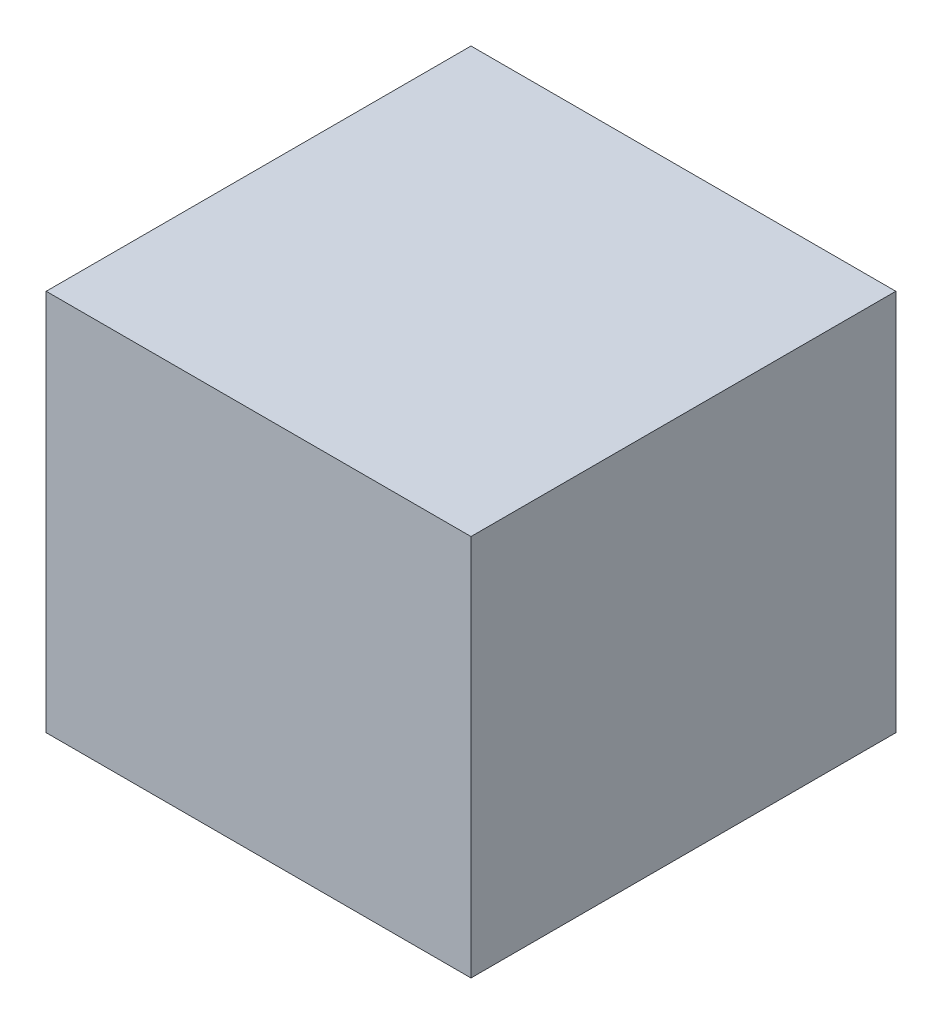
ISO-10303-21;
HEADER;
FILE_DESCRIPTION(('STEP AP214'),'2;1');
FILE_NAME('part.step','',(''),(''),'','','');
FILE_SCHEMA(('AUTOMOTIVE_DESIGN { 1 0 10303 214 1 1 1 1 }'));
ENDSEC;
DATA;
#1=APPLICATION_CONTEXT('core data for automotive mechanical design processes');
#2=APPLICATION_PROTOCOL_DEFINITION('international standard','automotive_design',2000,#1);
#3=PRODUCT_CONTEXT('',#1,'mechanical');
#4=PRODUCT('Part','Part','',(#3));
#5=PRODUCT_RELATED_PRODUCT_CATEGORY('part','',(#4));
#6=PRODUCT_DEFINITION_FORMATION('','',#4);
#7=PRODUCT_DEFINITION_CONTEXT('part definition',#1,'design');
#8=PRODUCT_DEFINITION('design','',#6,#7);
#9=PRODUCT_DEFINITION_SHAPE('','',#8);
#10=(LENGTH_UNIT() NAMED_UNIT(*) SI_UNIT(.MILLI.,.METRE.));
#11=(NAMED_UNIT(*) PLANE_ANGLE_UNIT() SI_UNIT($,.RADIAN.));
#12=(NAMED_UNIT(*) SI_UNIT($,.STERADIAN.) SOLID_ANGLE_UNIT());
#13=UNCERTAINTY_MEASURE_WITH_UNIT(LENGTH_MEASURE(1.E-05),#10,'distance_accuracy_value','');
#14=(GEOMETRIC_REPRESENTATION_CONTEXT(3) GLOBAL_UNCERTAINTY_ASSIGNED_CONTEXT((#13)) GLOBAL_UNIT_ASSIGNED_CONTEXT((#10,
#11,#12)) REPRESENTATION_CONTEXT('',''));
#15=CARTESIAN_POINT('',(0.,0.,0.));
#16=DIRECTION('',(0.,0.,1.));
#17=DIRECTION('',(1.,0.,0.));
#18=AXIS2_PLACEMENT_3D('',#15,#16,#17);
#19=CARTESIAN_POINT('',(63.5,114.3,63.5));
#20=DIRECTION('',(-1.,0.,0.));
#21=DIRECTION('',(0.,0.,1.));
#22=AXIS2_PLACEMENT_3D('',#19,#20,#21);
#23=PLANE('',#22);
#24=DIRECTION('',(0.,0.,-1.));
#25=VECTOR('',#24,1.);
#26=CARTESIAN_POINT('',(63.5,0.,63.5));
#27=LINE('',#26,#25);
#28=CARTESIAN_POINT('',(63.5,0.,63.5));
#29=VERTEX_POINT('',#28);
#30=CARTESIAN_POINT('',(63.5,0.,-63.5));
#31=VERTEX_POINT('',#30);
#32=EDGE_CURVE('E96',#29,#31,#27,.T.);
#33=ORIENTED_EDGE('',*,*,#32,.T.);
#34=DIRECTION('',(0.,-1.,0.));
#35=VECTOR('',#34,1.);
#36=CARTESIAN_POINT('',(63.5,114.3,-63.5));
#37=LINE('',#36,#35);
#38=CARTESIAN_POINT('',(63.5,114.3,-63.5));
#39=VERTEX_POINT('',#38);
#40=EDGE_CURVE('E11',#39,#31,#37,.T.);
#41=ORIENTED_EDGE('',*,*,#40,.F.);
#42=DIRECTION('',(0.,0.,-1.));
#43=VECTOR('',#42,1.);
#44=CARTESIAN_POINT('',(63.5,114.3,63.5));
#45=LINE('',#44,#43);
#46=CARTESIAN_POINT('',(63.5,114.3,63.5));
#47=VERTEX_POINT('',#46);
#48=EDGE_CURVE('E84',#47,#39,#45,.T.);
#49=ORIENTED_EDGE('',*,*,#48,.F.);
#50=DIRECTION('',(0.,-1.,0.));
#51=VECTOR('',#50,1.);
#52=CARTESIAN_POINT('',(63.5,114.3,63.5));
#53=LINE('',#52,#51);
#54=EDGE_CURVE('E92',#47,#29,#53,.T.);
#55=ORIENTED_EDGE('',*,*,#54,.T.);
#56=EDGE_LOOP('',(#33,#41,#49,#55));
#57=FACE_BOUND('',#56,.T.);
#58=ADVANCED_FACE('F33',(#57),#23,.F.);
#59=CARTESIAN_POINT('',(-63.5,114.3,-63.5));
#60=DIRECTION('',(0.,0.,1.));
#61=DIRECTION('',(1.,0.,0.));
#62=AXIS2_PLACEMENT_3D('',#59,#60,#61);
#63=PLANE('',#62);
#64=DIRECTION('',(-1.,0.,0.));
#65=VECTOR('',#64,1.);
#66=CARTESIAN_POINT('',(-63.5,0.,-63.5));
#67=LINE('',#66,#65);
#68=CARTESIAN_POINT('',(-63.5,0.,-63.5));
#69=VERTEX_POINT('',#68);
#70=EDGE_CURVE('E88',#31,#69,#67,.T.);
#71=ORIENTED_EDGE('',*,*,#70,.T.);
#72=DIRECTION('',(0.,-1.,0.));
#73=VECTOR('',#72,1.);
#74=CARTESIAN_POINT('',(-63.5,114.3,-63.5));
#75=LINE('',#74,#73);
#76=CARTESIAN_POINT('',(-63.5,114.3,-63.5));
#77=VERTEX_POINT('',#76);
#78=EDGE_CURVE('E41',#77,#69,#75,.T.);
#79=ORIENTED_EDGE('',*,*,#78,.F.);
#80=DIRECTION('',(-1.,0.,0.));
#81=VECTOR('',#80,1.);
#82=CARTESIAN_POINT('',(-63.5,114.3,-63.5));
#83=LINE('',#82,#81);
#84=EDGE_CURVE('E79',#39,#77,#83,.T.);
#85=ORIENTED_EDGE('',*,*,#84,.F.);
#86=ORIENTED_EDGE('',*,*,#40,.T.);
#87=EDGE_LOOP('',(#71,#79,#85,#86));
#88=FACE_BOUND('',#87,.T.);
#89=ADVANCED_FACE('F87',(#88),#63,.F.);
#90=CARTESIAN_POINT('',(-63.5,114.3,63.5));
#91=DIRECTION('',(1.,0.,0.));
#92=DIRECTION('',(0.,0.,-1.));
#93=AXIS2_PLACEMENT_3D('',#90,#91,#92);
#94=PLANE('',#93);
#95=DIRECTION('',(0.,0.,1.));
#96=VECTOR('',#95,1.);
#97=CARTESIAN_POINT('',(-63.5,0.,63.5));
#98=LINE('',#97,#96);
#99=CARTESIAN_POINT('',(-63.5,0.,63.5));
#100=VERTEX_POINT('',#99);
#101=EDGE_CURVE('E66',#69,#100,#98,.T.);
#102=ORIENTED_EDGE('',*,*,#101,.T.);
#103=DIRECTION('',(0.,-1.,0.));
#104=VECTOR('',#103,1.);
#105=CARTESIAN_POINT('',(-63.5,114.3,63.5));
#106=LINE('',#105,#104);
#107=CARTESIAN_POINT('',(-63.5,114.3,63.5));
#108=VERTEX_POINT('',#107);
#109=EDGE_CURVE('E89',#108,#100,#106,.T.);
#110=ORIENTED_EDGE('',*,*,#109,.F.);
#111=DIRECTION('',(0.,0.,1.));
#112=VECTOR('',#111,1.);
#113=CARTESIAN_POINT('',(-63.5,114.3,63.5));
#114=LINE('',#113,#112);
#115=EDGE_CURVE('E82',#77,#108,#114,.T.);
#116=ORIENTED_EDGE('',*,*,#115,.F.);
#117=ORIENTED_EDGE('',*,*,#78,.T.);
#118=EDGE_LOOP('',(#102,#110,#116,#117));
#119=FACE_BOUND('',#118,.T.);
#120=ADVANCED_FACE('F90',(#119),#94,.F.);
#121=CARTESIAN_POINT('',(-63.5,114.3,63.5));
#122=DIRECTION('',(0.,0.,-1.));
#123=DIRECTION('',(-1.,0.,0.));
#124=AXIS2_PLACEMENT_3D('',#121,#122,#123);
#125=PLANE('',#124);
#126=DIRECTION('',(1.,0.,0.));
#127=VECTOR('',#126,1.);
#128=CARTESIAN_POINT('',(-63.5,0.,63.5));
#129=LINE('',#128,#127);
#130=EDGE_CURVE('E72',#100,#29,#129,.T.);
#131=ORIENTED_EDGE('',*,*,#130,.T.);
#132=ORIENTED_EDGE('',*,*,#54,.F.);
#133=DIRECTION('',(1.,0.,0.));
#134=VECTOR('',#133,1.);
#135=CARTESIAN_POINT('',(-63.5,114.3,63.5));
#136=LINE('',#135,#134);
#137=EDGE_CURVE('E49',#108,#47,#136,.T.);
#138=ORIENTED_EDGE('',*,*,#137,.F.);
#139=ORIENTED_EDGE('',*,*,#109,.T.);
#140=EDGE_LOOP('',(#131,#132,#138,#139));
#141=FACE_BOUND('',#140,.T.);
#142=ADVANCED_FACE('F103',(#141),#125,.F.);
#143=CARTESIAN_POINT('',(63.5,114.3,-63.5));
#144=DIRECTION('',(0.,-1.,0.));
#145=DIRECTION('',(0.,0.,-1.));
#146=AXIS2_PLACEMENT_3D('',#143,#144,#145);
#147=PLANE('',#146);
#148=ORIENTED_EDGE('',*,*,#48,.T.);
#149=ORIENTED_EDGE('',*,*,#84,.T.);
#150=ORIENTED_EDGE('',*,*,#115,.T.);
#151=ORIENTED_EDGE('',*,*,#137,.T.);
#152=EDGE_LOOP('',(#148,#149,#150,#151));
#153=FACE_BOUND('',#152,.T.);
#154=ADVANCED_FACE('F80',(#153),#147,.F.);
#155=CARTESIAN_POINT('',(63.5,0.,-63.5));
#156=DIRECTION('',(0.,-1.,0.));
#157=DIRECTION('',(0.,0.,-1.));
#158=AXIS2_PLACEMENT_3D('',#155,#156,#157);
#159=PLANE('',#158);
#160=ORIENTED_EDGE('',*,*,#32,.F.);
#161=ORIENTED_EDGE('',*,*,#130,.F.);
#162=ORIENTED_EDGE('',*,*,#101,.F.);
#163=ORIENTED_EDGE('',*,*,#70,.F.);
#164=EDGE_LOOP('',(#160,#161,#162,#163));
#165=FACE_BOUND('',#164,.T.);
#166=ADVANCED_FACE('F106',(#165),#159,.T.);
#167=CLOSED_SHELL('',(#58,#89,#120,#142,#154,#166));
#168=MANIFOLD_SOLID_BREP('B2',#167);
#169=ADVANCED_BREP_SHAPE_REPRESENTATION('',(#18,#168),#14);
#170=SHAPE_DEFINITION_REPRESENTATION(#9,#169);
ENDSEC;
END-ISO-10303-21;
